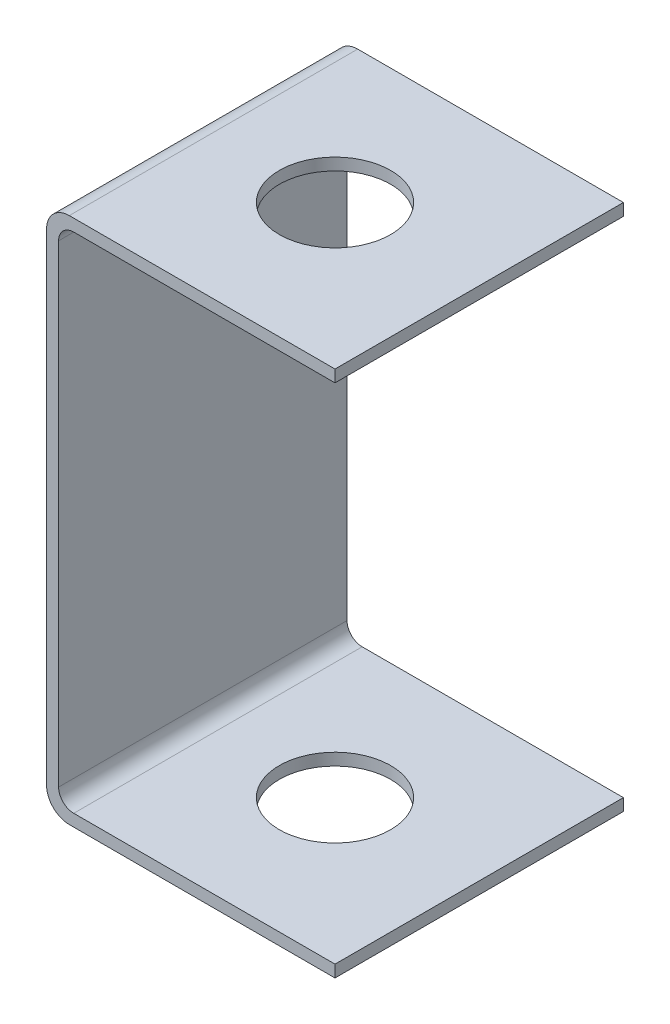
ISO-10303-21;
HEADER;
FILE_DESCRIPTION(('STEP AP214'),'2;1');
FILE_NAME('part.step','',(''),(''),'','','');
FILE_SCHEMA(('AUTOMOTIVE_DESIGN { 1 0 10303 214 1 1 1 1 }'));
ENDSEC;
DATA;
#1=APPLICATION_CONTEXT('core data for automotive mechanical design processes');
#2=APPLICATION_PROTOCOL_DEFINITION('international standard','automotive_design',2000,#1);
#3=PRODUCT_CONTEXT('',#1,'mechanical');
#4=PRODUCT('Part','Part','',(#3));
#5=PRODUCT_RELATED_PRODUCT_CATEGORY('part','',(#4));
#6=PRODUCT_DEFINITION_FORMATION('','',#4);
#7=PRODUCT_DEFINITION_CONTEXT('part definition',#1,'design');
#8=PRODUCT_DEFINITION('design','',#6,#7);
#9=PRODUCT_DEFINITION_SHAPE('','',#8);
#10=(LENGTH_UNIT() NAMED_UNIT(*) SI_UNIT(.MILLI.,.METRE.));
#11=(NAMED_UNIT(*) PLANE_ANGLE_UNIT() SI_UNIT($,.RADIAN.));
#12=(NAMED_UNIT(*) SI_UNIT($,.STERADIAN.) SOLID_ANGLE_UNIT());
#13=UNCERTAINTY_MEASURE_WITH_UNIT(LENGTH_MEASURE(1.E-05),#10,'distance_accuracy_value','');
#14=(GEOMETRIC_REPRESENTATION_CONTEXT(3) GLOBAL_UNCERTAINTY_ASSIGNED_CONTEXT((#13)) GLOBAL_UNIT_ASSIGNED_CONTEXT((#10,
#11,#12)) REPRESENTATION_CONTEXT('',''));
#15=CARTESIAN_POINT('',(0.,0.,0.));
#16=DIRECTION('',(0.,0.,1.));
#17=DIRECTION('',(1.,0.,0.));
#18=AXIS2_PLACEMENT_3D('',#15,#16,#17);
#19=CARTESIAN_POINT('',(-17.4625,1.5875,38.1));
#20=DIRECTION('',(-1.,0.,0.));
#21=DIRECTION('',(0.,-1.,0.));
#22=AXIS2_PLACEMENT_3D('',#19,#20,#21);
#23=PLANE('',#22);
#24=DIRECTION('',(0.,1.,0.));
#25=VECTOR('',#24,1.);
#26=CARTESIAN_POINT('',(-17.4625,1.5875,38.1));
#27=LINE('',#26,#25);
#28=CARTESIAN_POINT('',(-17.4625,3.5875,38.1));
#29=VERTEX_POINT('',#28);
#30=CARTESIAN_POINT('',(-17.4625,66.0875,38.1));
#31=VERTEX_POINT('',#30);
#32=EDGE_CURVE('E135',#29,#31,#27,.T.);
#33=ORIENTED_EDGE('',*,*,#32,.F.);
#34=DIRECTION('',(0.,0.,-1.));
#35=VECTOR('',#34,1.);
#36=CARTESIAN_POINT('',(-17.4625,3.5875,0.));
#37=LINE('',#36,#35);
#38=CARTESIAN_POINT('',(-17.4625,3.5875,0.));
#39=VERTEX_POINT('',#38);
#40=EDGE_CURVE('E193',#29,#39,#37,.T.);
#41=ORIENTED_EDGE('',*,*,#40,.T.);
#42=DIRECTION('',(0.,1.,0.));
#43=VECTOR('',#42,1.);
#44=CARTESIAN_POINT('',(-17.4625,1.5875,0.));
#45=LINE('',#44,#43);
#46=CARTESIAN_POINT('',(-17.4625,66.0875,0.));
#47=VERTEX_POINT('',#46);
#48=EDGE_CURVE('E164',#39,#47,#45,.T.);
#49=ORIENTED_EDGE('',*,*,#48,.T.);
#50=DIRECTION('',(0.,0.,-1.));
#51=VECTOR('',#50,1.);
#52=CARTESIAN_POINT('',(-17.4625,66.0875,38.1));
#53=LINE('',#52,#51);
#54=EDGE_CURVE('E144',#47,#31,#53,.F.);
#55=ORIENTED_EDGE('',*,*,#54,.T.);
#56=EDGE_LOOP('',(#33,#41,#49,#55));
#57=FACE_BOUND('',#56,.T.);
#58=ADVANCED_FACE('F33',(#57),#23,.F.);
#59=CARTESIAN_POINT('',(-17.4625,68.0875,38.1));
#60=DIRECTION('',(0.,1.,0.));
#61=DIRECTION('',(0.,0.,1.));
#62=AXIS2_PLACEMENT_3D('',#59,#60,#61);
#63=PLANE('',#62);
#64=CARTESIAN_POINT('',(0.,68.0875,19.05));
#65=DIRECTION('',(0.,1.,0.));
#66=DIRECTION('',(0.,0.,1.));
#67=AXIS2_PLACEMENT_3D('',#64,#65,#66);
#68=CIRCLE('',#67,7.35);
#69=CARTESIAN_POINT('',(0.,68.0875,26.4));
#70=VERTEX_POINT('',#69);
#71=EDGE_CURVE('E167',#70,#70,#68,.F.);
#72=ORIENTED_EDGE('',*,*,#71,.F.);
#73=EDGE_LOOP('',(#72));
#74=FACE_BOUND('',#73,.T.);
#75=DIRECTION('',(1.,0.,0.));
#76=VECTOR('',#75,1.);
#77=CARTESIAN_POINT('',(-17.4625,68.0875,38.1));
#78=LINE('',#77,#76);
#79=CARTESIAN_POINT('',(-15.4625,68.0875,38.1));
#80=VERTEX_POINT('',#79);
#81=CARTESIAN_POINT('',(19.05,68.0875,38.1));
#82=VERTEX_POINT('',#81);
#83=EDGE_CURVE('E123',#80,#82,#78,.T.);
#84=ORIENTED_EDGE('',*,*,#83,.F.);
#85=DIRECTION('',(0.,0.,-1.));
#86=VECTOR('',#85,1.);
#87=CARTESIAN_POINT('',(-15.4625,68.0875,0.));
#88=LINE('',#87,#86);
#89=CARTESIAN_POINT('',(-15.4625,68.0875,0.));
#90=VERTEX_POINT('',#89);
#91=EDGE_CURVE('E198',#80,#90,#88,.T.);
#92=ORIENTED_EDGE('',*,*,#91,.T.);
#93=DIRECTION('',(1.,0.,0.));
#94=VECTOR('',#93,1.);
#95=CARTESIAN_POINT('',(-17.4625,68.0875,0.));
#96=LINE('',#95,#94);
#97=CARTESIAN_POINT('',(19.05,68.0875,0.));
#98=VERTEX_POINT('',#97);
#99=EDGE_CURVE('E141',#90,#98,#96,.T.);
#100=ORIENTED_EDGE('',*,*,#99,.T.);
#101=DIRECTION('',(0.,0.,-1.));
#102=VECTOR('',#101,1.);
#103=CARTESIAN_POINT('',(19.05,68.0875,38.1));
#104=LINE('',#103,#102);
#105=EDGE_CURVE('E138',#82,#98,#104,.T.);
#106=ORIENTED_EDGE('',*,*,#105,.F.);
#107=EDGE_LOOP('',(#84,#92,#100,#106));
#108=FACE_BOUND('',#107,.T.);
#109=ADVANCED_FACE('F139',(#74,#108),#63,.F.);
#110=CARTESIAN_POINT('',(19.05,68.0875,38.1));
#111=DIRECTION('',(-1.,0.,0.));
#112=DIRECTION('',(0.,-1.,0.));
#113=AXIS2_PLACEMENT_3D('',#110,#111,#112);
#114=PLANE('',#113);
#115=DIRECTION('',(0.,1.,0.));
#116=VECTOR('',#115,1.);
#117=CARTESIAN_POINT('',(19.05,68.0875,0.));
#118=LINE('',#117,#116);
#119=CARTESIAN_POINT('',(19.05,69.675,0.));
#120=VERTEX_POINT('',#119);
#121=EDGE_CURVE('E169',#98,#120,#118,.T.);
#122=ORIENTED_EDGE('',*,*,#121,.T.);
#123=DIRECTION('',(0.,0.,-1.));
#124=VECTOR('',#123,1.);
#125=CARTESIAN_POINT('',(19.05,69.675,38.1));
#126=LINE('',#125,#124);
#127=CARTESIAN_POINT('',(19.05,69.675,38.1));
#128=VERTEX_POINT('',#127);
#129=EDGE_CURVE('E145',#128,#120,#126,.T.);
#130=ORIENTED_EDGE('',*,*,#129,.F.);
#131=DIRECTION('',(0.,1.,0.));
#132=VECTOR('',#131,1.);
#133=CARTESIAN_POINT('',(19.05,68.0875,38.1));
#134=LINE('',#133,#132);
#135=EDGE_CURVE('E127',#82,#128,#134,.T.);
#136=ORIENTED_EDGE('',*,*,#135,.F.);
#137=ORIENTED_EDGE('',*,*,#105,.T.);
#138=EDGE_LOOP('',(#122,#130,#136,#137));
#139=FACE_BOUND('',#138,.T.);
#140=ADVANCED_FACE('F147',(#139),#114,.F.);
#141=CARTESIAN_POINT('',(19.05,69.675,38.1));
#142=DIRECTION('',(0.,-1.,0.));
#143=DIRECTION('',(0.,0.,-1.));
#144=AXIS2_PLACEMENT_3D('',#141,#142,#143);
#145=PLANE('',#144);
#146=CARTESIAN_POINT('',(0.,69.675,19.05));
#147=DIRECTION('',(0.,1.,0.));
#148=DIRECTION('',(0.,0.,1.));
#149=AXIS2_PLACEMENT_3D('',#146,#147,#148);
#150=CIRCLE('',#149,7.35);
#151=CARTESIAN_POINT('',(0.,69.675,26.4));
#152=VERTEX_POINT('',#151);
#153=EDGE_CURVE('E191',#152,#152,#150,.T.);
#154=ORIENTED_EDGE('',*,*,#153,.F.);
#155=EDGE_LOOP('',(#154));
#156=FACE_BOUND('',#155,.T.);
#157=DIRECTION('',(-1.,0.,0.));
#158=VECTOR('',#157,1.);
#159=CARTESIAN_POINT('',(19.05,69.675,0.));
#160=LINE('',#159,#158);
#161=CARTESIAN_POINT('',(-16.05,69.675,0.));
#162=VERTEX_POINT('',#161);
#163=EDGE_CURVE('E171',#120,#162,#160,.T.);
#164=ORIENTED_EDGE('',*,*,#163,.T.);
#165=DIRECTION('',(0.,0.,-1.));
#166=VECTOR('',#165,1.);
#167=CARTESIAN_POINT('',(-16.05,69.675,38.1));
#168=LINE('',#167,#166);
#169=CARTESIAN_POINT('',(-16.05,69.675,38.1));
#170=VERTEX_POINT('',#169);
#171=EDGE_CURVE('E11',#162,#170,#168,.F.);
#172=ORIENTED_EDGE('',*,*,#171,.T.);
#173=DIRECTION('',(-1.,0.,0.));
#174=VECTOR('',#173,1.);
#175=CARTESIAN_POINT('',(19.05,69.675,38.1));
#176=LINE('',#175,#174);
#177=EDGE_CURVE('E149',#128,#170,#176,.T.);
#178=ORIENTED_EDGE('',*,*,#177,.F.);
#179=ORIENTED_EDGE('',*,*,#129,.T.);
#180=EDGE_LOOP('',(#164,#172,#178,#179));
#181=FACE_BOUND('',#180,.T.);
#182=ADVANCED_FACE('F238',(#156,#181),#145,.F.);
#183=CARTESIAN_POINT('',(-19.05,69.675,38.1));
#184=DIRECTION('',(1.,0.,0.));
#185=DIRECTION('',(0.,1.,0.));
#186=AXIS2_PLACEMENT_3D('',#183,#184,#185);
#187=PLANE('',#186);
#188=DIRECTION('',(0.,-1.,0.));
#189=VECTOR('',#188,1.);
#190=CARTESIAN_POINT('',(-19.05,69.675,0.));
#191=LINE('',#190,#189);
#192=CARTESIAN_POINT('',(-19.05,66.675,0.));
#193=VERTEX_POINT('',#192);
#194=CARTESIAN_POINT('',(-19.05,3.,0.));
#195=VERTEX_POINT('',#194);
#196=EDGE_CURVE('E173',#193,#195,#191,.T.);
#197=ORIENTED_EDGE('',*,*,#196,.T.);
#198=DIRECTION('',(0.,0.,-1.));
#199=VECTOR('',#198,1.);
#200=CARTESIAN_POINT('',(-19.05,3.,38.1));
#201=LINE('',#200,#199);
#202=CARTESIAN_POINT('',(-19.05,3.,38.1));
#203=VERTEX_POINT('',#202);
#204=EDGE_CURVE('E54',#195,#203,#201,.F.);
#205=ORIENTED_EDGE('',*,*,#204,.T.);
#206=DIRECTION('',(0.,-1.,0.));
#207=VECTOR('',#206,1.);
#208=CARTESIAN_POINT('',(-19.05,69.675,38.1));
#209=LINE('',#208,#207);
#210=CARTESIAN_POINT('',(-19.05,66.675,38.1));
#211=VERTEX_POINT('',#210);
#212=EDGE_CURVE('E151',#211,#203,#209,.T.);
#213=ORIENTED_EDGE('',*,*,#212,.F.);
#214=DIRECTION('',(0.,0.,-1.));
#215=VECTOR('',#214,1.);
#216=CARTESIAN_POINT('',(-19.05,66.675,38.1));
#217=LINE('',#216,#215);
#218=EDGE_CURVE('E214',#211,#193,#217,.T.);
#219=ORIENTED_EDGE('',*,*,#218,.T.);
#220=EDGE_LOOP('',(#197,#205,#213,#219));
#221=FACE_BOUND('',#220,.T.);
#222=ADVANCED_FACE('F233',(#221),#187,.F.);
#223=CARTESIAN_POINT('',(-19.05,0.,38.1));
#224=DIRECTION('',(0.,1.,0.));
#225=DIRECTION('',(0.,0.,1.));
#226=AXIS2_PLACEMENT_3D('',#223,#224,#225);
#227=PLANE('',#226);
#228=CARTESIAN_POINT('',(0.,0.,19.05));
#229=DIRECTION('',(0.,1.,0.));
#230=DIRECTION('',(0.,0.,1.));
#231=AXIS2_PLACEMENT_3D('',#228,#229,#230);
#232=CIRCLE('',#231,7.35);
#233=CARTESIAN_POINT('',(0.,0.,26.4));
#234=VERTEX_POINT('',#233);
#235=EDGE_CURVE('E394',#234,#234,#232,.T.);
#236=ORIENTED_EDGE('',*,*,#235,.T.);
#237=EDGE_LOOP('',(#236));
#238=FACE_BOUND('',#237,.T.);
#239=DIRECTION('',(1.,0.,0.));
#240=VECTOR('',#239,1.);
#241=CARTESIAN_POINT('',(-19.05,0.,38.1));
#242=LINE('',#241,#240);
#243=CARTESIAN_POINT('',(-16.05,0.,38.1));
#244=VERTEX_POINT('',#243);
#245=CARTESIAN_POINT('',(19.05,0.,38.1));
#246=VERTEX_POINT('',#245);
#247=EDGE_CURVE('E156',#244,#246,#242,.T.);
#248=ORIENTED_EDGE('',*,*,#247,.F.);
#249=DIRECTION('',(0.,0.,-1.));
#250=VECTOR('',#249,1.);
#251=CARTESIAN_POINT('',(-16.05,0.,38.1));
#252=LINE('',#251,#250);
#253=CARTESIAN_POINT('',(-16.05,0.,0.));
#254=VERTEX_POINT('',#253);
#255=EDGE_CURVE('E207',#244,#254,#252,.T.);
#256=ORIENTED_EDGE('',*,*,#255,.T.);
#257=DIRECTION('',(1.,0.,0.));
#258=VECTOR('',#257,1.);
#259=CARTESIAN_POINT('',(-19.05,0.,0.));
#260=LINE('',#259,#258);
#261=CARTESIAN_POINT('',(19.05,0.,0.));
#262=VERTEX_POINT('',#261);
#263=EDGE_CURVE('E175',#254,#262,#260,.T.);
#264=ORIENTED_EDGE('',*,*,#263,.T.);
#265=DIRECTION('',(0.,0.,-1.));
#266=VECTOR('',#265,1.);
#267=CARTESIAN_POINT('',(19.05,0.,38.1));
#268=LINE('',#267,#266);
#269=EDGE_CURVE('E184',#246,#262,#268,.T.);
#270=ORIENTED_EDGE('',*,*,#269,.F.);
#271=EDGE_LOOP('',(#248,#256,#264,#270));
#272=FACE_BOUND('',#271,.T.);
#273=ADVANCED_FACE('F225',(#238,#272),#227,.F.);
#274=CARTESIAN_POINT('',(19.05,0.,38.1));
#275=DIRECTION('',(-1.,0.,0.));
#276=DIRECTION('',(0.,-1.,0.));
#277=AXIS2_PLACEMENT_3D('',#274,#275,#276);
#278=PLANE('',#277);
#279=DIRECTION('',(0.,1.,0.));
#280=VECTOR('',#279,1.);
#281=CARTESIAN_POINT('',(19.05,0.,0.));
#282=LINE('',#281,#280);
#283=CARTESIAN_POINT('',(19.05,1.5875,0.));
#284=VERTEX_POINT('',#283);
#285=EDGE_CURVE('E177',#262,#284,#282,.T.);
#286=ORIENTED_EDGE('',*,*,#285,.T.);
#287=DIRECTION('',(0.,0.,-1.));
#288=VECTOR('',#287,1.);
#289=CARTESIAN_POINT('',(19.05,1.5875,38.1));
#290=LINE('',#289,#288);
#291=CARTESIAN_POINT('',(19.05,1.5875,38.1));
#292=VERTEX_POINT('',#291);
#293=EDGE_CURVE('E163',#292,#284,#290,.T.);
#294=ORIENTED_EDGE('',*,*,#293,.F.);
#295=DIRECTION('',(0.,1.,0.));
#296=VECTOR('',#295,1.);
#297=CARTESIAN_POINT('',(19.05,0.,38.1));
#298=LINE('',#297,#296);
#299=EDGE_CURVE('E158',#246,#292,#298,.T.);
#300=ORIENTED_EDGE('',*,*,#299,.F.);
#301=ORIENTED_EDGE('',*,*,#269,.T.);
#302=EDGE_LOOP('',(#286,#294,#300,#301));
#303=FACE_BOUND('',#302,.T.);
#304=ADVANCED_FACE('F309',(#303),#278,.F.);
#305=CARTESIAN_POINT('',(19.05,1.5875,38.1));
#306=DIRECTION('',(0.,-1.,0.));
#307=DIRECTION('',(1.,0.,0.));
#308=AXIS2_PLACEMENT_3D('',#305,#306,#307);
#309=PLANE('',#308);
#310=CARTESIAN_POINT('',(0.,1.58750000000001,19.05));
#311=DIRECTION('',(0.,-1.,0.));
#312=DIRECTION('',(1.,0.,0.));
#313=AXIS2_PLACEMENT_3D('',#310,#311,#312);
#314=CIRCLE('',#313,7.35);
#315=CARTESIAN_POINT('',(7.35,1.58750000000001,19.05));
#316=VERTEX_POINT('',#315);
#317=EDGE_CURVE('E188',#316,#316,#314,.F.);
#318=ORIENTED_EDGE('',*,*,#317,.F.);
#319=EDGE_LOOP('',(#318));
#320=FACE_BOUND('',#319,.T.);
#321=DIRECTION('',(-1.,0.,0.));
#322=VECTOR('',#321,1.);
#323=CARTESIAN_POINT('',(19.05,1.5875,0.));
#324=LINE('',#323,#322);
#325=CARTESIAN_POINT('',(-15.4625,1.5875,0.));
#326=VERTEX_POINT('',#325);
#327=EDGE_CURVE('E179',#284,#326,#324,.T.);
#328=ORIENTED_EDGE('',*,*,#327,.T.);
#329=DIRECTION('',(0.,0.,-1.));
#330=VECTOR('',#329,1.);
#331=CARTESIAN_POINT('',(-15.4625,1.5875,38.1));
#332=LINE('',#331,#330);
#333=CARTESIAN_POINT('',(-15.4625,1.5875,38.1));
#334=VERTEX_POINT('',#333);
#335=EDGE_CURVE('E196',#326,#334,#332,.F.);
#336=ORIENTED_EDGE('',*,*,#335,.T.);
#337=DIRECTION('',(-1.,0.,0.));
#338=VECTOR('',#337,1.);
#339=CARTESIAN_POINT('',(19.05,1.5875,38.1));
#340=LINE('',#339,#338);
#341=EDGE_CURVE('E160',#292,#334,#340,.T.);
#342=ORIENTED_EDGE('',*,*,#341,.F.);
#343=ORIENTED_EDGE('',*,*,#293,.T.);
#344=EDGE_LOOP('',(#328,#336,#342,#343));
#345=FACE_BOUND('',#344,.T.);
#346=ADVANCED_FACE('F298',(#320,#345),#309,.F.);
#347=CARTESIAN_POINT('',(0.,0.,38.1));
#348=DIRECTION('',(0.,0.,-1.));
#349=DIRECTION('',(-1.,0.,0.));
#350=AXIS2_PLACEMENT_3D('',#347,#348,#349);
#351=PLANE('',#350);
#352=ORIENTED_EDGE('',*,*,#212,.T.);
#353=CARTESIAN_POINT('',(-16.05,3.,38.1));
#354=DIRECTION('',(0.,0.,-1.));
#355=DIRECTION('',(-1.,0.,0.));
#356=AXIS2_PLACEMENT_3D('',#353,#354,#355);
#357=CIRCLE('',#356,3.);
#358=EDGE_CURVE('E41',#203,#244,#357,.F.);
#359=ORIENTED_EDGE('',*,*,#358,.T.);
#360=ORIENTED_EDGE('',*,*,#247,.T.);
#361=ORIENTED_EDGE('',*,*,#299,.T.);
#362=ORIENTED_EDGE('',*,*,#341,.T.);
#363=CARTESIAN_POINT('',(-15.4625,3.5875,38.1));
#364=DIRECTION('',(0.,0.,-1.));
#365=DIRECTION('',(-1.,0.,0.));
#366=AXIS2_PLACEMENT_3D('',#363,#364,#365);
#367=CIRCLE('',#366,2.);
#368=EDGE_CURVE('E202',#334,#29,#367,.T.);
#369=ORIENTED_EDGE('',*,*,#368,.T.);
#370=ORIENTED_EDGE('',*,*,#32,.T.);
#371=CARTESIAN_POINT('',(-15.4625,66.0875,38.1));
#372=DIRECTION('',(0.,0.,-1.));
#373=DIRECTION('',(-1.,0.,0.));
#374=AXIS2_PLACEMENT_3D('',#371,#372,#373);
#375=CIRCLE('',#374,2.);
#376=EDGE_CURVE('E131',#31,#80,#375,.T.);
#377=ORIENTED_EDGE('',*,*,#376,.T.);
#378=ORIENTED_EDGE('',*,*,#83,.T.);
#379=ORIENTED_EDGE('',*,*,#135,.T.);
#380=ORIENTED_EDGE('',*,*,#177,.T.);
#381=CARTESIAN_POINT('',(-16.05,66.675,38.1));
#382=DIRECTION('',(0.,0.,-1.));
#383=DIRECTION('',(-1.,0.,0.));
#384=AXIS2_PLACEMENT_3D('',#381,#382,#383);
#385=CIRCLE('',#384,3.);
#386=EDGE_CURVE('E218',#170,#211,#385,.F.);
#387=ORIENTED_EDGE('',*,*,#386,.T.);
#388=EDGE_LOOP('',(#352,#359,#360,#361,#362,#369,#370,#377,#378,#379,#380,#387));
#389=FACE_BOUND('',#388,.T.);
#390=ADVANCED_FACE('F125',(#389),#351,.F.);
#391=CARTESIAN_POINT('',(0.,0.,0.));
#392=DIRECTION('',(0.,0.,-1.));
#393=DIRECTION('',(-1.,0.,0.));
#394=AXIS2_PLACEMENT_3D('',#391,#392,#393);
#395=PLANE('',#394);
#396=ORIENTED_EDGE('',*,*,#263,.F.);
#397=CARTESIAN_POINT('',(-16.05,3.,0.));
#398=DIRECTION('',(0.,0.,-1.));
#399=DIRECTION('',(-1.,0.,0.));
#400=AXIS2_PLACEMENT_3D('',#397,#398,#399);
#401=CIRCLE('',#400,3.);
#402=EDGE_CURVE('E212',#254,#195,#401,.T.);
#403=ORIENTED_EDGE('',*,*,#402,.T.);
#404=ORIENTED_EDGE('',*,*,#196,.F.);
#405=CARTESIAN_POINT('',(-16.05,66.675,0.));
#406=DIRECTION('',(0.,0.,-1.));
#407=DIRECTION('',(-1.,0.,0.));
#408=AXIS2_PLACEMENT_3D('',#405,#406,#407);
#409=CIRCLE('',#408,3.);
#410=EDGE_CURVE('E210',#193,#162,#409,.T.);
#411=ORIENTED_EDGE('',*,*,#410,.T.);
#412=ORIENTED_EDGE('',*,*,#163,.F.);
#413=ORIENTED_EDGE('',*,*,#121,.F.);
#414=ORIENTED_EDGE('',*,*,#99,.F.);
#415=CARTESIAN_POINT('',(-15.4625,66.0875,0.));
#416=DIRECTION('',(0.,0.,-1.));
#417=DIRECTION('',(-1.,0.,0.));
#418=AXIS2_PLACEMENT_3D('',#415,#416,#417);
#419=CIRCLE('',#418,2.);
#420=EDGE_CURVE('E204',#90,#47,#419,.F.);
#421=ORIENTED_EDGE('',*,*,#420,.T.);
#422=ORIENTED_EDGE('',*,*,#48,.F.);
#423=CARTESIAN_POINT('',(-15.4625,3.5875,0.));
#424=DIRECTION('',(0.,0.,-1.));
#425=DIRECTION('',(-1.,0.,0.));
#426=AXIS2_PLACEMENT_3D('',#423,#424,#425);
#427=CIRCLE('',#426,2.);
#428=EDGE_CURVE('E200',#39,#326,#427,.F.);
#429=ORIENTED_EDGE('',*,*,#428,.T.);
#430=ORIENTED_EDGE('',*,*,#327,.F.);
#431=ORIENTED_EDGE('',*,*,#285,.F.);
#432=EDGE_LOOP('',(#396,#403,#404,#411,#412,#413,#414,#421,#422,#429,#430,#431));
#433=FACE_BOUND('',#432,.T.);
#434=ADVANCED_FACE('F231',(#433),#395,.T.);
#435=CARTESIAN_POINT('',(0.,69.675,19.05));
#436=DIRECTION('',(0.,-1.,0.));
#437=DIRECTION('',(0.,0.,-1.));
#438=AXIS2_PLACEMENT_3D('',#435,#436,#437);
#439=CYLINDRICAL_SURFACE('',#438,7.35);
#440=ORIENTED_EDGE('',*,*,#235,.F.);
#441=EDGE_LOOP('',(#440));
#442=FACE_BOUND('',#441,.T.);
#443=ORIENTED_EDGE('',*,*,#317,.T.);
#444=EDGE_LOOP('',(#443));
#445=FACE_BOUND('',#444,.T.);
#446=ADVANCED_FACE('F287',(#442,#445),#439,.F.);
#447=ORIENTED_EDGE('',*,*,#153,.T.);
#448=EDGE_LOOP('',(#447));
#449=FACE_BOUND('',#448,.T.);
#450=ORIENTED_EDGE('',*,*,#71,.T.);
#451=EDGE_LOOP('',(#450));
#452=FACE_BOUND('',#451,.T.);
#453=ADVANCED_FACE('F263',(#449,#452),#439,.F.);
#454=CARTESIAN_POINT('',(-15.4625,3.5875,38.1));
#455=DIRECTION('',(0.,0.,1.));
#456=DIRECTION('',(1.,0.,0.));
#457=AXIS2_PLACEMENT_3D('',#454,#455,#456);
#458=CYLINDRICAL_SURFACE('',#457,2.);
#459=ORIENTED_EDGE('',*,*,#368,.F.);
#460=ORIENTED_EDGE('',*,*,#335,.F.);
#461=ORIENTED_EDGE('',*,*,#428,.F.);
#462=ORIENTED_EDGE('',*,*,#40,.F.);
#463=EDGE_LOOP('',(#459,#460,#461,#462));
#464=FACE_BOUND('',#463,.T.);
#465=ADVANCED_FACE('F259',(#464),#458,.F.);
#466=CARTESIAN_POINT('',(-15.4625,66.0875,38.1));
#467=DIRECTION('',(0.,0.,1.));
#468=DIRECTION('',(1.,0.,0.));
#469=AXIS2_PLACEMENT_3D('',#466,#467,#468);
#470=CYLINDRICAL_SURFACE('',#469,2.);
#471=ORIENTED_EDGE('',*,*,#376,.F.);
#472=ORIENTED_EDGE('',*,*,#54,.F.);
#473=ORIENTED_EDGE('',*,*,#420,.F.);
#474=ORIENTED_EDGE('',*,*,#91,.F.);
#475=EDGE_LOOP('',(#471,#472,#473,#474));
#476=FACE_BOUND('',#475,.T.);
#477=ADVANCED_FACE('F262',(#476),#470,.F.);
#478=CARTESIAN_POINT('',(-16.05,3.,38.1));
#479=DIRECTION('',(0.,0.,-1.));
#480=DIRECTION('',(-1.,0.,0.));
#481=AXIS2_PLACEMENT_3D('',#478,#479,#480);
#482=CYLINDRICAL_SURFACE('',#481,3.);
#483=ORIENTED_EDGE('',*,*,#358,.F.);
#484=ORIENTED_EDGE('',*,*,#204,.F.);
#485=ORIENTED_EDGE('',*,*,#402,.F.);
#486=ORIENTED_EDGE('',*,*,#255,.F.);
#487=EDGE_LOOP('',(#483,#484,#485,#486));
#488=FACE_BOUND('',#487,.T.);
#489=ADVANCED_FACE('F228',(#488),#482,.T.);
#490=CARTESIAN_POINT('',(-16.05,66.675,38.1));
#491=DIRECTION('',(0.,0.,-1.));
#492=DIRECTION('',(-1.,0.,0.));
#493=AXIS2_PLACEMENT_3D('',#490,#491,#492);
#494=CYLINDRICAL_SURFACE('',#493,3.);
#495=ORIENTED_EDGE('',*,*,#386,.F.);
#496=ORIENTED_EDGE('',*,*,#171,.F.);
#497=ORIENTED_EDGE('',*,*,#410,.F.);
#498=ORIENTED_EDGE('',*,*,#218,.F.);
#499=EDGE_LOOP('',(#495,#496,#497,#498));
#500=FACE_BOUND('',#499,.T.);
#501=ADVANCED_FACE('F35',(#500),#494,.T.);
#502=CLOSED_SHELL('',(#58,#109,#140,#182,#222,#273,#304,#346,#390,#434,#446,#453,#465,#477,#489,#501));
#503=MANIFOLD_SOLID_BREP('B2',#502);
#504=ADVANCED_BREP_SHAPE_REPRESENTATION('',(#18,#503),#14);
#505=SHAPE_DEFINITION_REPRESENTATION(#9,#504);
ENDSEC;
END-ISO-10303-21;
